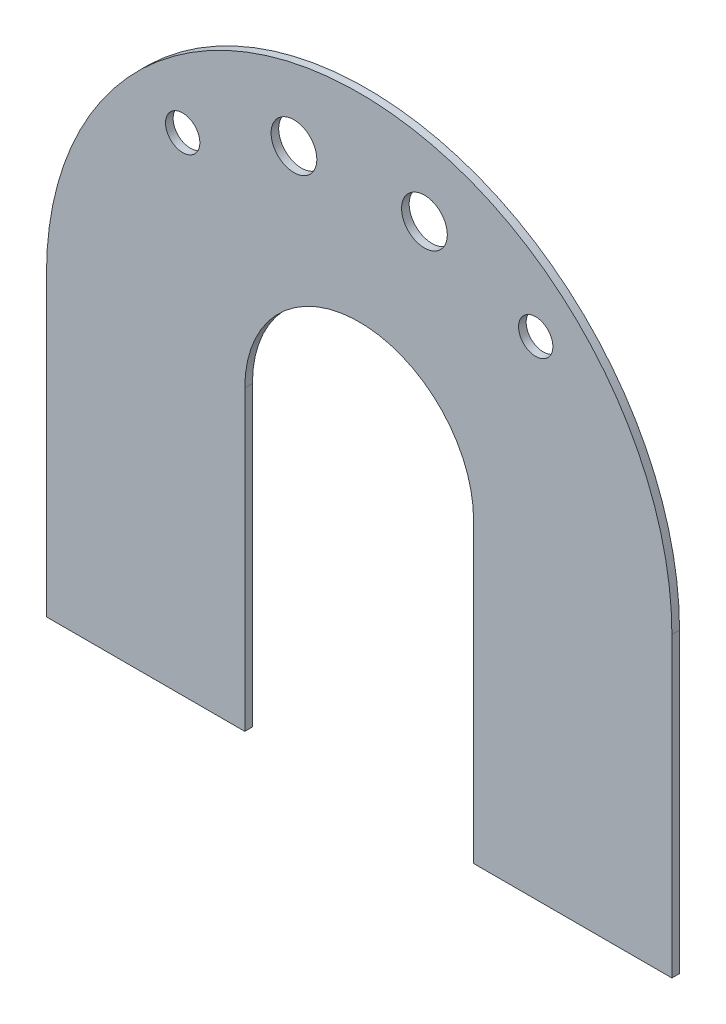
ISO-10303-21;
HEADER;
FILE_DESCRIPTION(('STEP AP214'),'2;1');
FILE_NAME('part.step','',(''),(''),'','','');
FILE_SCHEMA(('AUTOMOTIVE_DESIGN { 1 0 10303 214 1 1 1 1 }'));
ENDSEC;
DATA;
#1=APPLICATION_CONTEXT('core data for automotive mechanical design processes');
#2=APPLICATION_PROTOCOL_DEFINITION('international standard','automotive_design',2000,#1);
#3=PRODUCT_CONTEXT('',#1,'mechanical');
#4=PRODUCT('Part','Part','',(#3));
#5=PRODUCT_RELATED_PRODUCT_CATEGORY('part','',(#4));
#6=PRODUCT_DEFINITION_FORMATION('','',#4);
#7=PRODUCT_DEFINITION_CONTEXT('part definition',#1,'design');
#8=PRODUCT_DEFINITION('design','',#6,#7);
#9=PRODUCT_DEFINITION_SHAPE('','',#8);
#10=(LENGTH_UNIT() NAMED_UNIT(*) SI_UNIT(.MILLI.,.METRE.));
#11=(NAMED_UNIT(*) PLANE_ANGLE_UNIT() SI_UNIT($,.RADIAN.));
#12=(NAMED_UNIT(*) SI_UNIT($,.STERADIAN.) SOLID_ANGLE_UNIT());
#13=UNCERTAINTY_MEASURE_WITH_UNIT(LENGTH_MEASURE(1.E-05),#10,'distance_accuracy_value','');
#14=(GEOMETRIC_REPRESENTATION_CONTEXT(3) GLOBAL_UNCERTAINTY_ASSIGNED_CONTEXT((#13)) GLOBAL_UNIT_ASSIGNED_CONTEXT((#10,
#11,#12)) REPRESENTATION_CONTEXT('',''));
#15=CARTESIAN_POINT('',(0.,0.,0.));
#16=DIRECTION('',(0.,0.,1.));
#17=DIRECTION('',(1.,0.,0.));
#18=AXIS2_PLACEMENT_3D('',#15,#16,#17);
#19=CARTESIAN_POINT('',(-410.,-390.,10.));
#20=DIRECTION('',(0.,1.,0.));
#21=DIRECTION('',(0.,0.,1.));
#22=AXIS2_PLACEMENT_3D('',#19,#20,#21);
#23=PLANE('',#22);
#24=DIRECTION('',(1.,0.,0.));
#25=VECTOR('',#24,1.);
#26=CARTESIAN_POINT('',(-410.,-390.,10.));
#27=LINE('',#26,#25);
#28=CARTESIAN_POINT('',(150.,-390.,10.));
#29=VERTEX_POINT('',#28);
#30=CARTESIAN_POINT('',(410.,-390.,10.));
#31=VERTEX_POINT('',#30);
#32=EDGE_CURVE('E155',#29,#31,#27,.T.);
#33=ORIENTED_EDGE('',*,*,#32,.F.);
#34=DIRECTION('',(0.,0.,1.));
#35=VECTOR('',#34,1.);
#36=CARTESIAN_POINT('',(150.,-390.,-40.));
#37=LINE('',#36,#35);
#38=CARTESIAN_POINT('',(150.,-390.,0.));
#39=VERTEX_POINT('',#38);
#40=EDGE_CURVE('E137',#39,#29,#37,.T.);
#41=ORIENTED_EDGE('',*,*,#40,.F.);
#42=DIRECTION('',(1.,0.,0.));
#43=VECTOR('',#42,1.);
#44=CARTESIAN_POINT('',(-410.,-390.,0.));
#45=LINE('',#44,#43);
#46=CARTESIAN_POINT('',(410.,-390.,0.));
#47=VERTEX_POINT('',#46);
#48=EDGE_CURVE('E164',#39,#47,#45,.T.);
#49=ORIENTED_EDGE('',*,*,#48,.T.);
#50=DIRECTION('',(0.,0.,-1.));
#51=VECTOR('',#50,1.);
#52=CARTESIAN_POINT('',(410.,-390.,10.));
#53=LINE('',#52,#51);
#54=EDGE_CURVE('E170',#31,#47,#53,.T.);
#55=ORIENTED_EDGE('',*,*,#54,.F.);
#56=EDGE_LOOP('',(#33,#41,#49,#55));
#57=FACE_BOUND('',#56,.T.);
#58=ADVANCED_FACE('F35',(#57),#23,.F.);
#59=CARTESIAN_POINT('',(0.,0.,10.));
#60=DIRECTION('',(0.,0.,-1.));
#61=DIRECTION('',(-1.,0.,0.));
#62=AXIS2_PLACEMENT_3D('',#59,#60,#61);
#63=CYLINDRICAL_SURFACE('',#62,410.);
#64=CARTESIAN_POINT('',(0.,0.,0.));
#65=DIRECTION('',(0.,0.,1.));
#66=DIRECTION('',(1.,0.,0.));
#67=AXIS2_PLACEMENT_3D('',#64,#65,#66);
#68=CIRCLE('',#67,410.);
#69=CARTESIAN_POINT('',(410.,0.,0.));
#70=VERTEX_POINT('',#69);
#71=CARTESIAN_POINT('',(-410.,0.,0.));
#72=VERTEX_POINT('',#71);
#73=EDGE_CURVE('E159',#70,#72,#68,.T.);
#74=ORIENTED_EDGE('',*,*,#73,.T.);
#75=DIRECTION('',(0.,0.,-1.));
#76=VECTOR('',#75,1.);
#77=CARTESIAN_POINT('',(-410.,0.,10.));
#78=LINE('',#77,#76);
#79=CARTESIAN_POINT('',(-410.,0.,10.));
#80=VERTEX_POINT('',#79);
#81=EDGE_CURVE('E175',#80,#72,#78,.T.);
#82=ORIENTED_EDGE('',*,*,#81,.F.);
#83=CARTESIAN_POINT('',(0.,0.,10.));
#84=DIRECTION('',(0.,0.,1.));
#85=DIRECTION('',(1.,0.,0.));
#86=AXIS2_PLACEMENT_3D('',#83,#84,#85);
#87=CIRCLE('',#86,410.);
#88=CARTESIAN_POINT('',(410.,0.,10.));
#89=VERTEX_POINT('',#88);
#90=EDGE_CURVE('E152',#89,#80,#87,.T.);
#91=ORIENTED_EDGE('',*,*,#90,.F.);
#92=DIRECTION('',(0.,0.,-1.));
#93=VECTOR('',#92,1.);
#94=CARTESIAN_POINT('',(410.,0.,10.));
#95=LINE('',#94,#93);
#96=EDGE_CURVE('E158',#89,#70,#95,.T.);
#97=ORIENTED_EDGE('',*,*,#96,.T.);
#98=EDGE_LOOP('',(#74,#82,#91,#97));
#99=FACE_BOUND('',#98,.T.);
#100=ADVANCED_FACE('F37',(#99),#63,.T.);
#101=CARTESIAN_POINT('',(-410.,0.,10.));
#102=DIRECTION('',(1.,0.,0.));
#103=DIRECTION('',(0.,1.,0.));
#104=AXIS2_PLACEMENT_3D('',#101,#102,#103);
#105=PLANE('',#104);
#106=DIRECTION('',(0.,-1.,0.));
#107=VECTOR('',#106,1.);
#108=CARTESIAN_POINT('',(-410.,0.,0.));
#109=LINE('',#108,#107);
#110=CARTESIAN_POINT('',(-410.,-390.,0.));
#111=VERTEX_POINT('',#110);
#112=EDGE_CURVE('E162',#72,#111,#109,.T.);
#113=ORIENTED_EDGE('',*,*,#112,.T.);
#114=DIRECTION('',(0.,0.,-1.));
#115=VECTOR('',#114,1.);
#116=CARTESIAN_POINT('',(-410.,-390.,10.));
#117=LINE('',#116,#115);
#118=CARTESIAN_POINT('',(-410.,-390.,10.));
#119=VERTEX_POINT('',#118);
#120=EDGE_CURVE('E172',#119,#111,#117,.T.);
#121=ORIENTED_EDGE('',*,*,#120,.F.);
#122=DIRECTION('',(0.,-1.,0.));
#123=VECTOR('',#122,1.);
#124=CARTESIAN_POINT('',(-410.,0.,10.));
#125=LINE('',#124,#123);
#126=EDGE_CURVE('E88',#80,#119,#125,.T.);
#127=ORIENTED_EDGE('',*,*,#126,.F.);
#128=ORIENTED_EDGE('',*,*,#81,.T.);
#129=EDGE_LOOP('',(#113,#121,#127,#128));
#130=FACE_BOUND('',#129,.T.);
#131=ADVANCED_FACE('F201',(#130),#105,.F.);
#132=CARTESIAN_POINT('',(-150.,-390.,0.));
#133=VERTEX_POINT('',#132);
#134=EDGE_CURVE('E165',#111,#133,#45,.T.);
#135=ORIENTED_EDGE('',*,*,#134,.T.);
#136=DIRECTION('',(0.,0.,1.));
#137=VECTOR('',#136,1.);
#138=CARTESIAN_POINT('',(-150.,-390.,-40.));
#139=LINE('',#138,#137);
#140=CARTESIAN_POINT('',(-150.,-390.,10.));
#141=VERTEX_POINT('',#140);
#142=EDGE_CURVE('E50',#133,#141,#139,.T.);
#143=ORIENTED_EDGE('',*,*,#142,.T.);
#144=EDGE_CURVE('E130',#119,#141,#27,.T.);
#145=ORIENTED_EDGE('',*,*,#144,.F.);
#146=ORIENTED_EDGE('',*,*,#120,.T.);
#147=EDGE_LOOP('',(#135,#143,#145,#146));
#148=FACE_BOUND('',#147,.T.);
#149=ADVANCED_FACE('F203',(#148),#23,.F.);
#150=CARTESIAN_POINT('',(410.,-390.,10.));
#151=DIRECTION('',(-1.,0.,0.));
#152=DIRECTION('',(0.,-1.,0.));
#153=AXIS2_PLACEMENT_3D('',#150,#151,#152);
#154=PLANE('',#153);
#155=DIRECTION('',(0.,1.,0.));
#156=VECTOR('',#155,1.);
#157=CARTESIAN_POINT('',(410.,-390.,0.));
#158=LINE('',#157,#156);
#159=EDGE_CURVE('E80',#47,#70,#158,.T.);
#160=ORIENTED_EDGE('',*,*,#159,.T.);
#161=ORIENTED_EDGE('',*,*,#96,.F.);
#162=DIRECTION('',(0.,1.,0.));
#163=VECTOR('',#162,1.);
#164=CARTESIAN_POINT('',(410.,-390.,10.));
#165=LINE('',#164,#163);
#166=EDGE_CURVE('E59',#31,#89,#165,.T.);
#167=ORIENTED_EDGE('',*,*,#166,.F.);
#168=ORIENTED_EDGE('',*,*,#54,.T.);
#169=EDGE_LOOP('',(#160,#161,#167,#168));
#170=FACE_BOUND('',#169,.T.);
#171=ADVANCED_FACE('F196',(#170),#154,.F.);
#172=CARTESIAN_POINT('',(0.,0.,10.));
#173=DIRECTION('',(0.,0.,1.));
#174=DIRECTION('',(1.,0.,0.));
#175=AXIS2_PLACEMENT_3D('',#172,#173,#174);
#176=PLANE('',#175);
#177=DIRECTION('',(0.,1.,0.));
#178=VECTOR('',#177,1.);
#179=CARTESIAN_POINT('',(150.,-390.,10.));
#180=LINE('',#179,#178);
#181=CARTESIAN_POINT('',(150.,0.,10.));
#182=VERTEX_POINT('',#181);
#183=EDGE_CURVE('E116',#29,#182,#180,.T.);
#184=ORIENTED_EDGE('',*,*,#183,.F.);
#185=ORIENTED_EDGE('',*,*,#32,.T.);
#186=ORIENTED_EDGE('',*,*,#166,.T.);
#187=ORIENTED_EDGE('',*,*,#90,.T.);
#188=ORIENTED_EDGE('',*,*,#126,.T.);
#189=ORIENTED_EDGE('',*,*,#144,.T.);
#190=DIRECTION('',(0.,-1.,0.));
#191=VECTOR('',#190,1.);
#192=CARTESIAN_POINT('',(-150.,0.,10.));
#193=LINE('',#192,#191);
#194=CARTESIAN_POINT('',(-150.,0.,10.));
#195=VERTEX_POINT('',#194);
#196=EDGE_CURVE('E112',#195,#141,#193,.T.);
#197=ORIENTED_EDGE('',*,*,#196,.F.);
#198=CARTESIAN_POINT('',(0.,0.,10.));
#199=DIRECTION('',(0.,0.,1.));
#200=DIRECTION('',(1.,0.,0.));
#201=AXIS2_PLACEMENT_3D('',#198,#199,#200);
#202=CIRCLE('',#201,150.);
#203=EDGE_CURVE('E119',#182,#195,#202,.T.);
#204=ORIENTED_EDGE('',*,*,#203,.F.);
#205=EDGE_LOOP('',(#184,#185,#186,#187,#188,#189,#197,#204));
#206=FACE_BOUND('',#205,.T.);
#207=CARTESIAN_POINT('',(231.415444703881,248.973278176937,10.));
#208=DIRECTION('',(0.,0.,1.));
#209=DIRECTION('',(1.,0.,0.));
#210=AXIS2_PLACEMENT_3D('',#207,#208,#209);
#211=CIRCLE('',#210,22.5);
#212=CARTESIAN_POINT('',(253.915444703881,248.973278176937,10.));
#213=VERTEX_POINT('',#212);
#214=EDGE_CURVE('E136',#213,#213,#211,.T.);
#215=ORIENTED_EDGE('',*,*,#214,.F.);
#216=EDGE_LOOP('',(#215));
#217=FACE_BOUND('',#216,.T.);
#218=CARTESIAN_POINT('',(-231.415444703881,248.973278176937,10.));
#219=DIRECTION('',(0.,0.,1.));
#220=DIRECTION('',(1.,0.,0.));
#221=AXIS2_PLACEMENT_3D('',#218,#219,#220);
#222=CIRCLE('',#221,22.5);
#223=CARTESIAN_POINT('',(-208.915444703881,248.973278176937,10.));
#224=VERTEX_POINT('',#223);
#225=EDGE_CURVE('E144',#224,#224,#222,.T.);
#226=ORIENTED_EDGE('',*,*,#225,.F.);
#227=EDGE_LOOP('',(#226));
#228=FACE_BOUND('',#227,.T.);
#229=CARTESIAN_POINT('',(85.5362998077809,306.665948586456,10.));
#230=DIRECTION('',(0.,0.,1.));
#231=DIRECTION('',(1.,0.,0.));
#232=AXIS2_PLACEMENT_3D('',#229,#230,#231);
#233=CIRCLE('',#232,30.);
#234=CARTESIAN_POINT('',(115.536299807781,306.665948586456,10.));
#235=VERTEX_POINT('',#234);
#236=EDGE_CURVE('E140',#235,#235,#233,.T.);
#237=ORIENTED_EDGE('',*,*,#236,.F.);
#238=EDGE_LOOP('',(#237));
#239=FACE_BOUND('',#238,.T.);
#240=CARTESIAN_POINT('',(-85.5362998077809,306.665948586456,10.));
#241=DIRECTION('',(0.,0.,1.));
#242=DIRECTION('',(1.,0.,0.));
#243=AXIS2_PLACEMENT_3D('',#240,#241,#242);
#244=CIRCLE('',#243,30.);
#245=CARTESIAN_POINT('',(-55.5362998077809,306.665948586456,10.));
#246=VERTEX_POINT('',#245);
#247=EDGE_CURVE('E147',#246,#246,#244,.T.);
#248=ORIENTED_EDGE('',*,*,#247,.F.);
#249=EDGE_LOOP('',(#248));
#250=FACE_BOUND('',#249,.T.);
#251=ADVANCED_FACE('F127',(#206,#217,#228,#239,#250),#176,.T.);
#252=CARTESIAN_POINT('',(0.,0.,0.));
#253=DIRECTION('',(0.,0.,1.));
#254=DIRECTION('',(1.,0.,0.));
#255=AXIS2_PLACEMENT_3D('',#252,#253,#254);
#256=PLANE('',#255);
#257=CARTESIAN_POINT('',(231.415444703881,248.973278176937,0.));
#258=DIRECTION('',(0.,0.,1.));
#259=DIRECTION('',(1.,0.,0.));
#260=AXIS2_PLACEMENT_3D('',#257,#258,#259);
#261=CIRCLE('',#260,22.5);
#262=CARTESIAN_POINT('',(253.915444703881,248.973278176937,0.));
#263=VERTEX_POINT('',#262);
#264=EDGE_CURVE('E151',#263,#263,#261,.T.);
#265=ORIENTED_EDGE('',*,*,#264,.T.);
#266=EDGE_LOOP('',(#265));
#267=FACE_BOUND('',#266,.T.);
#268=CARTESIAN_POINT('',(-231.415444703881,248.973278176937,0.));
#269=DIRECTION('',(0.,0.,1.));
#270=DIRECTION('',(1.,0.,0.));
#271=AXIS2_PLACEMENT_3D('',#268,#269,#270);
#272=CIRCLE('',#271,22.5);
#273=CARTESIAN_POINT('',(-208.915444703881,248.973278176937,0.));
#274=VERTEX_POINT('',#273);
#275=EDGE_CURVE('E181',#274,#274,#272,.T.);
#276=ORIENTED_EDGE('',*,*,#275,.T.);
#277=EDGE_LOOP('',(#276));
#278=FACE_BOUND('',#277,.T.);
#279=CARTESIAN_POINT('',(85.5362998077809,306.665948586456,0.));
#280=DIRECTION('',(0.,0.,1.));
#281=DIRECTION('',(1.,0.,0.));
#282=AXIS2_PLACEMENT_3D('',#279,#280,#281);
#283=CIRCLE('',#282,30.);
#284=CARTESIAN_POINT('',(115.536299807781,306.665948586456,0.));
#285=VERTEX_POINT('',#284);
#286=EDGE_CURVE('E143',#285,#285,#283,.T.);
#287=ORIENTED_EDGE('',*,*,#286,.T.);
#288=EDGE_LOOP('',(#287));
#289=FACE_BOUND('',#288,.T.);
#290=CARTESIAN_POINT('',(-85.5362998077809,306.665948586456,0.));
#291=DIRECTION('',(0.,0.,1.));
#292=DIRECTION('',(1.,0.,0.));
#293=AXIS2_PLACEMENT_3D('',#290,#291,#292);
#294=CIRCLE('',#293,30.);
#295=CARTESIAN_POINT('',(-55.5362998077809,306.665948586456,0.));
#296=VERTEX_POINT('',#295);
#297=EDGE_CURVE('E150',#296,#296,#294,.T.);
#298=ORIENTED_EDGE('',*,*,#297,.T.);
#299=EDGE_LOOP('',(#298));
#300=FACE_BOUND('',#299,.T.);
#301=ORIENTED_EDGE('',*,*,#48,.F.);
#302=DIRECTION('',(0.,1.,0.));
#303=VECTOR('',#302,1.);
#304=CARTESIAN_POINT('',(150.,0.,0.));
#305=LINE('',#304,#303);
#306=CARTESIAN_POINT('',(150.,0.,0.));
#307=VERTEX_POINT('',#306);
#308=EDGE_CURVE('E11',#39,#307,#305,.T.);
#309=ORIENTED_EDGE('',*,*,#308,.T.);
#310=CARTESIAN_POINT('',(0.,0.,0.));
#311=DIRECTION('',(0.,0.,1.));
#312=DIRECTION('',(1.,0.,0.));
#313=AXIS2_PLACEMENT_3D('',#310,#311,#312);
#314=CIRCLE('',#313,150.);
#315=CARTESIAN_POINT('',(-150.,0.,0.));
#316=VERTEX_POINT('',#315);
#317=EDGE_CURVE('E43',#307,#316,#314,.T.);
#318=ORIENTED_EDGE('',*,*,#317,.T.);
#319=DIRECTION('',(0.,-1.,0.));
#320=VECTOR('',#319,1.);
#321=CARTESIAN_POINT('',(-150.,0.,0.));
#322=LINE('',#321,#320);
#323=EDGE_CURVE('E113',#316,#133,#322,.T.);
#324=ORIENTED_EDGE('',*,*,#323,.T.);
#325=ORIENTED_EDGE('',*,*,#134,.F.);
#326=ORIENTED_EDGE('',*,*,#112,.F.);
#327=ORIENTED_EDGE('',*,*,#73,.F.);
#328=ORIENTED_EDGE('',*,*,#159,.F.);
#329=EDGE_LOOP('',(#301,#309,#318,#324,#325,#326,#327,#328));
#330=FACE_BOUND('',#329,.T.);
#331=ADVANCED_FACE('F188',(#267,#278,#289,#300,#330),#256,.F.);
#332=CARTESIAN_POINT('',(-85.5362998077809,306.665948586456,-40.));
#333=DIRECTION('',(0.,0.,1.));
#334=DIRECTION('',(1.,0.,0.));
#335=AXIS2_PLACEMENT_3D('',#332,#333,#334);
#336=CYLINDRICAL_SURFACE('',#335,30.);
#337=ORIENTED_EDGE('',*,*,#247,.T.);
#338=EDGE_LOOP('',(#337));
#339=FACE_BOUND('',#338,.T.);
#340=ORIENTED_EDGE('',*,*,#297,.F.);
#341=EDGE_LOOP('',(#340));
#342=FACE_BOUND('',#341,.T.);
#343=ADVANCED_FACE('F253',(#339,#342),#336,.F.);
#344=CARTESIAN_POINT('',(85.5362998077809,306.665948586456,-40.));
#345=DIRECTION('',(0.,0.,1.));
#346=DIRECTION('',(1.,0.,0.));
#347=AXIS2_PLACEMENT_3D('',#344,#345,#346);
#348=CYLINDRICAL_SURFACE('',#347,30.);
#349=ORIENTED_EDGE('',*,*,#236,.T.);
#350=EDGE_LOOP('',(#349));
#351=FACE_BOUND('',#350,.T.);
#352=ORIENTED_EDGE('',*,*,#286,.F.);
#353=EDGE_LOOP('',(#352));
#354=FACE_BOUND('',#353,.T.);
#355=ADVANCED_FACE('F262',(#351,#354),#348,.F.);
#356=CARTESIAN_POINT('',(-231.415444703881,248.973278176937,-40.));
#357=DIRECTION('',(0.,0.,1.));
#358=DIRECTION('',(1.,0.,0.));
#359=AXIS2_PLACEMENT_3D('',#356,#357,#358);
#360=CYLINDRICAL_SURFACE('',#359,22.5);
#361=ORIENTED_EDGE('',*,*,#225,.T.);
#362=EDGE_LOOP('',(#361));
#363=FACE_BOUND('',#362,.T.);
#364=ORIENTED_EDGE('',*,*,#275,.F.);
#365=EDGE_LOOP('',(#364));
#366=FACE_BOUND('',#365,.T.);
#367=ADVANCED_FACE('F272',(#363,#366),#360,.F.);
#368=CARTESIAN_POINT('',(231.415444703881,248.973278176937,-40.));
#369=DIRECTION('',(0.,0.,1.));
#370=DIRECTION('',(1.,0.,0.));
#371=AXIS2_PLACEMENT_3D('',#368,#369,#370);
#372=CYLINDRICAL_SURFACE('',#371,22.5);
#373=ORIENTED_EDGE('',*,*,#214,.T.);
#374=EDGE_LOOP('',(#373));
#375=FACE_BOUND('',#374,.T.);
#376=ORIENTED_EDGE('',*,*,#264,.F.);
#377=EDGE_LOOP('',(#376));
#378=FACE_BOUND('',#377,.T.);
#379=ADVANCED_FACE('F282',(#375,#378),#372,.F.);
#380=CARTESIAN_POINT('',(0.,0.,-40.));
#381=DIRECTION('',(0.,0.,1.));
#382=DIRECTION('',(1.,0.,0.));
#383=AXIS2_PLACEMENT_3D('',#380,#381,#382);
#384=CYLINDRICAL_SURFACE('',#383,150.);
#385=DIRECTION('',(0.,0.,1.));
#386=VECTOR('',#385,1.);
#387=CARTESIAN_POINT('',(150.,0.,-40.));
#388=LINE('',#387,#386);
#389=EDGE_CURVE('E122',#307,#182,#388,.T.);
#390=ORIENTED_EDGE('',*,*,#389,.T.);
#391=ORIENTED_EDGE('',*,*,#203,.T.);
#392=DIRECTION('',(0.,0.,1.));
#393=VECTOR('',#392,1.);
#394=CARTESIAN_POINT('',(-150.,0.,-40.));
#395=LINE('',#394,#393);
#396=EDGE_CURVE('E108',#316,#195,#395,.T.);
#397=ORIENTED_EDGE('',*,*,#396,.F.);
#398=ORIENTED_EDGE('',*,*,#317,.F.);
#399=EDGE_LOOP('',(#390,#391,#397,#398));
#400=FACE_BOUND('',#399,.T.);
#401=ADVANCED_FACE('F120',(#400),#384,.F.);
#402=CARTESIAN_POINT('',(150.,-390.,-40.));
#403=DIRECTION('',(1.,0.,0.));
#404=DIRECTION('',(0.,1.,0.));
#405=AXIS2_PLACEMENT_3D('',#402,#403,#404);
#406=PLANE('',#405);
#407=ORIENTED_EDGE('',*,*,#40,.T.);
#408=ORIENTED_EDGE('',*,*,#183,.T.);
#409=ORIENTED_EDGE('',*,*,#389,.F.);
#410=ORIENTED_EDGE('',*,*,#308,.F.);
#411=EDGE_LOOP('',(#407,#408,#409,#410));
#412=FACE_BOUND('',#411,.T.);
#413=ADVANCED_FACE('F191',(#412),#406,.F.);
#414=CARTESIAN_POINT('',(-150.,0.,-40.));
#415=DIRECTION('',(-1.,0.,0.));
#416=DIRECTION('',(0.,-1.,0.));
#417=AXIS2_PLACEMENT_3D('',#414,#415,#416);
#418=PLANE('',#417);
#419=ORIENTED_EDGE('',*,*,#396,.T.);
#420=ORIENTED_EDGE('',*,*,#196,.T.);
#421=ORIENTED_EDGE('',*,*,#142,.F.);
#422=ORIENTED_EDGE('',*,*,#323,.F.);
#423=EDGE_LOOP('',(#419,#420,#421,#422));
#424=FACE_BOUND('',#423,.T.);
#425=ADVANCED_FACE('F110',(#424),#418,.F.);
#426=CLOSED_SHELL('',(#58,#100,#131,#149,#171,#251,#331,#343,#355,#367,#379,#401,#413,#425));
#427=MANIFOLD_SOLID_BREP('B2',#426);
#428=ADVANCED_BREP_SHAPE_REPRESENTATION('',(#18,#427),#14);
#429=SHAPE_DEFINITION_REPRESENTATION(#9,#428);
ENDSEC;
END-ISO-10303-21;
